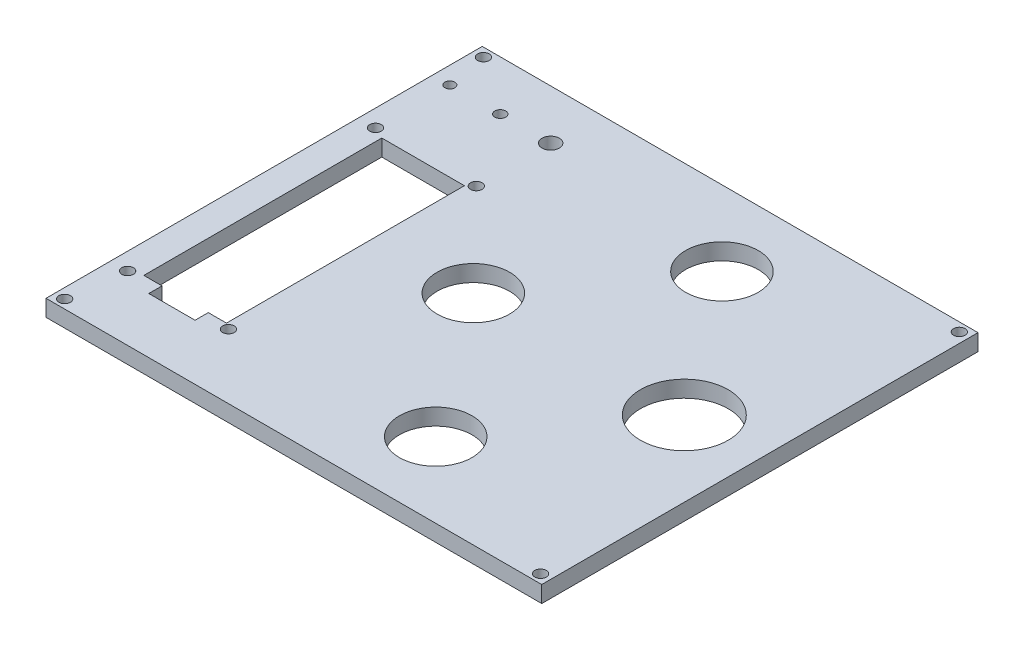
ISO-10303-21;
HEADER;
FILE_DESCRIPTION(('STEP AP214'),'2;1');
FILE_NAME('part.step','',(''),(''),'','','');
FILE_SCHEMA(('AUTOMOTIVE_DESIGN { 1 0 10303 214 1 1 1 1 }'));
ENDSEC;
DATA;
#1=APPLICATION_CONTEXT('core data for automotive mechanical design processes');
#2=APPLICATION_PROTOCOL_DEFINITION('international standard','automotive_design',2000,#1);
#3=PRODUCT_CONTEXT('',#1,'mechanical');
#4=PRODUCT('Part','Part','',(#3));
#5=PRODUCT_RELATED_PRODUCT_CATEGORY('part','',(#4));
#6=PRODUCT_DEFINITION_FORMATION('','',#4);
#7=PRODUCT_DEFINITION_CONTEXT('part definition',#1,'design');
#8=PRODUCT_DEFINITION('design','',#6,#7);
#9=PRODUCT_DEFINITION_SHAPE('','',#8);
#10=(LENGTH_UNIT() NAMED_UNIT(*) SI_UNIT(.MILLI.,.METRE.));
#11=(NAMED_UNIT(*) PLANE_ANGLE_UNIT() SI_UNIT($,.RADIAN.));
#12=(NAMED_UNIT(*) SI_UNIT($,.STERADIAN.) SOLID_ANGLE_UNIT());
#13=UNCERTAINTY_MEASURE_WITH_UNIT(LENGTH_MEASURE(1.E-05),#10,'distance_accuracy_value','');
#14=(GEOMETRIC_REPRESENTATION_CONTEXT(3) GLOBAL_UNCERTAINTY_ASSIGNED_CONTEXT((#13)) GLOBAL_UNIT_ASSIGNED_CONTEXT((#10,
#11,#12)) REPRESENTATION_CONTEXT('',''));
#15=CARTESIAN_POINT('',(0.,0.,0.));
#16=DIRECTION('',(0.,0.,1.));
#17=DIRECTION('',(1.,0.,0.));
#18=AXIS2_PLACEMENT_3D('',#15,#16,#17);
#19=CARTESIAN_POINT('',(0.,5.,0.));
#20=DIRECTION('',(0.,1.,0.));
#21=DIRECTION('',(0.,0.,1.));
#22=AXIS2_PLACEMENT_3D('',#19,#20,#21);
#23=PLANE('',#22);
#24=CARTESIAN_POINT('',(-11.7,5.,0.));
#25=DIRECTION('',(0.,1.,0.));
#26=DIRECTION('',(0.,0.,1.));
#27=AXIS2_PLACEMENT_3D('',#24,#25,#26);
#28=CIRCLE('',#27,10.975);
#29=CARTESIAN_POINT('',(-11.7,5.,10.975));
#30=VERTEX_POINT('',#29);
#31=EDGE_CURVE('E581',#30,#30,#28,.T.);
#32=ORIENTED_EDGE('',*,*,#31,.F.);
#33=EDGE_LOOP('',(#32));
#34=FACE_BOUND('',#33,.T.);
#35=CARTESIAN_POINT('',(20.2177973462517,5.,-43.3));
#36=DIRECTION('',(0.,1.,0.));
#37=DIRECTION('',(0.,0.,1.));
#38=AXIS2_PLACEMENT_3D('',#35,#36,#37);
#39=CIRCLE('',#38,10.975);
#40=CARTESIAN_POINT('',(20.2177973462517,5.,-32.325));
#41=VERTEX_POINT('',#40);
#42=EDGE_CURVE('E590',#41,#41,#39,.T.);
#43=ORIENTED_EDGE('',*,*,#42,.F.);
#44=EDGE_LOOP('',(#43));
#45=FACE_BOUND('',#44,.T.);
#46=CARTESIAN_POINT('',(20.2177973462517,5.,43.3));
#47=DIRECTION('',(0.,1.,0.));
#48=DIRECTION('',(0.,0.,1.));
#49=AXIS2_PLACEMENT_3D('',#46,#47,#48);
#50=CIRCLE('',#49,10.975);
#51=CARTESIAN_POINT('',(20.2177973462517,5.,54.275));
#52=VERTEX_POINT('',#51);
#53=EDGE_CURVE('E600',#52,#52,#50,.T.);
#54=ORIENTED_EDGE('',*,*,#53,.F.);
#55=EDGE_LOOP('',(#54));
#56=FACE_BOUND('',#55,.T.);
#57=CARTESIAN_POINT('',(52.1355946925034,5.,0.));
#58=DIRECTION('',(0.,1.,0.));
#59=DIRECTION('',(0.,0.,1.));
#60=AXIS2_PLACEMENT_3D('',#57,#58,#59);
#61=CIRCLE('',#60,13.275);
#62=CARTESIAN_POINT('',(52.1355946925034,5.,13.275));
#63=VERTEX_POINT('',#62);
#64=EDGE_CURVE('E608',#63,#63,#61,.T.);
#65=ORIENTED_EDGE('',*,*,#64,.F.);
#66=EDGE_LOOP('',(#65));
#67=FACE_BOUND('',#66,.T.);
#68=CARTESIAN_POINT('',(-69.8,5.,-51.));
#69=DIRECTION('',(0.,1.,0.));
#70=DIRECTION('',(0.,0.,1.));
#71=AXIS2_PLACEMENT_3D('',#68,#69,#70);
#72=CIRCLE('',#71,1.5);
#73=CARTESIAN_POINT('',(-69.8,5.,-49.5));
#74=VERTEX_POINT('',#73);
#75=EDGE_CURVE('E615',#74,#74,#72,.T.);
#76=ORIENTED_EDGE('',*,*,#75,.F.);
#77=EDGE_LOOP('',(#76));
#78=FACE_BOUND('',#77,.T.);
#79=CARTESIAN_POINT('',(-54.55,5.,-51.));
#80=DIRECTION('',(0.,1.,0.));
#81=DIRECTION('',(0.,0.,1.));
#82=AXIS2_PLACEMENT_3D('',#79,#80,#81);
#83=CIRCLE('',#82,1.64);
#84=CARTESIAN_POINT('',(-54.55,5.,-49.36));
#85=VERTEX_POINT('',#84);
#86=EDGE_CURVE('E623',#85,#85,#83,.T.);
#87=ORIENTED_EDGE('',*,*,#86,.F.);
#88=EDGE_LOOP('',(#87));
#89=FACE_BOUND('',#88,.T.);
#90=CARTESIAN_POINT('',(-39.3,5.,-51.));
#91=DIRECTION('',(0.,1.,0.));
#92=DIRECTION('',(0.,0.,1.));
#93=AXIS2_PLACEMENT_3D('',#90,#91,#92);
#94=CIRCLE('',#93,2.61);
#95=CARTESIAN_POINT('',(-39.3,5.,-48.39));
#96=VERTEX_POINT('',#95);
#97=EDGE_CURVE('E587',#96,#96,#94,.T.);
#98=ORIENTED_EDGE('',*,*,#97,.F.);
#99=EDGE_LOOP('',(#98));
#100=FACE_BOUND('',#99,.T.);
#101=CARTESIAN_POINT('',(-69.8,5.,-28.5));
#102=DIRECTION('',(0.,-1.,0.));
#103=DIRECTION('',(0.,0.,-1.));
#104=AXIS2_PLACEMENT_3D('',#101,#102,#103);
#105=CIRCLE('',#104,1.75);
#106=CARTESIAN_POINT('',(-69.8,5.,-30.25));
#107=VERTEX_POINT('',#106);
#108=EDGE_CURVE('E376',#107,#107,#105,.T.);
#109=ORIENTED_EDGE('',*,*,#108,.T.);
#110=EDGE_LOOP('',(#109));
#111=FACE_BOUND('',#110,.T.);
#112=CARTESIAN_POINT('',(-39.3,5.,46.5));
#113=DIRECTION('',(0.,-1.,0.));
#114=DIRECTION('',(0.,0.,-1.));
#115=AXIS2_PLACEMENT_3D('',#112,#113,#114);
#116=CIRCLE('',#115,1.75);
#117=CARTESIAN_POINT('',(-39.3,5.,44.75));
#118=VERTEX_POINT('',#117);
#119=EDGE_CURVE('E157',#118,#118,#116,.T.);
#120=ORIENTED_EDGE('',*,*,#119,.T.);
#121=EDGE_LOOP('',(#120));
#122=FACE_BOUND('',#121,.T.);
#123=DIRECTION('',(-1.,0.,0.));
#124=VECTOR('',#123,1.);
#125=CARTESIAN_POINT('',(0.,5.,49.2));
#126=LINE('',#125,#124);
#127=CARTESIAN_POINT('',(-46.7,5.,49.2));
#128=VERTEX_POINT('',#127);
#129=CARTESIAN_POINT('',(-60.7,5.,49.2));
#130=VERTEX_POINT('',#129);
#131=EDGE_CURVE('E137',#128,#130,#126,.T.);
#132=ORIENTED_EDGE('',*,*,#131,.T.);
#133=DIRECTION('',(0.,0.,1.));
#134=VECTOR('',#133,1.);
#135=CARTESIAN_POINT('',(-60.7,5.,0.));
#136=LINE('',#135,#134);
#137=CARTESIAN_POINT('',(-60.7,5.,45.2));
#138=VERTEX_POINT('',#137);
#139=EDGE_CURVE('E130',#138,#130,#136,.T.);
#140=ORIENTED_EDGE('',*,*,#139,.F.);
#141=DIRECTION('',(-1.,0.,0.));
#142=VECTOR('',#141,1.);
#143=CARTESIAN_POINT('',(1.7107527515815E-13,5.,45.1999999999998));
#144=LINE('',#143,#142);
#145=CARTESIAN_POINT('',(-66.2,5.,45.2));
#146=VERTEX_POINT('',#145);
#147=EDGE_CURVE('E140',#138,#146,#144,.T.);
#148=ORIENTED_EDGE('',*,*,#147,.T.);
#149=DIRECTION('',(0.,0.,-1.));
#150=VECTOR('',#149,1.);
#151=CARTESIAN_POINT('',(-66.2,5.,0.));
#152=LINE('',#151,#150);
#153=CARTESIAN_POINT('',(-66.2,5.,-26.8));
#154=VERTEX_POINT('',#153);
#155=EDGE_CURVE('E54',#146,#154,#152,.T.);
#156=ORIENTED_EDGE('',*,*,#155,.T.);
#157=DIRECTION('',(-1.,0.,0.));
#158=VECTOR('',#157,1.);
#159=CARTESIAN_POINT('',(0.,5.,-26.8));
#160=LINE('',#159,#158);
#161=CARTESIAN_POINT('',(-41.2,5.,-26.8));
#162=VERTEX_POINT('',#161);
#163=EDGE_CURVE('E162',#162,#154,#160,.T.);
#164=ORIENTED_EDGE('',*,*,#163,.F.);
#165=DIRECTION('',(0.,0.,-1.));
#166=VECTOR('',#165,1.);
#167=CARTESIAN_POINT('',(-41.2,5.,0.));
#168=LINE('',#167,#166);
#169=CARTESIAN_POINT('',(-41.2,5.,45.2));
#170=VERTEX_POINT('',#169);
#171=EDGE_CURVE('E165',#170,#162,#168,.T.);
#172=ORIENTED_EDGE('',*,*,#171,.F.);
#173=DIRECTION('',(-1.,0.,0.));
#174=VECTOR('',#173,1.);
#175=CARTESIAN_POINT('',(-1.71075275158149E-13,5.,45.2000000000002));
#176=LINE('',#175,#174);
#177=CARTESIAN_POINT('',(-46.7,5.,45.2));
#178=VERTEX_POINT('',#177);
#179=EDGE_CURVE('E168',#170,#178,#176,.T.);
#180=ORIENTED_EDGE('',*,*,#179,.T.);
#181=DIRECTION('',(0.,0.,1.));
#182=VECTOR('',#181,1.);
#183=CARTESIAN_POINT('',(-46.7,5.,0.));
#184=LINE('',#183,#182);
#185=EDGE_CURVE('E172',#178,#128,#184,.T.);
#186=ORIENTED_EDGE('',*,*,#185,.T.);
#187=EDGE_LOOP('',(#132,#140,#148,#156,#164,#172,#180,#186));
#188=FACE_BOUND('',#187,.T.);
#189=CARTESIAN_POINT('',(-71.997145932309,5.,63.3574884204319));
#190=DIRECTION('',(0.,1.,0.));
#191=DIRECTION('',(0.,0.,1.));
#192=AXIS2_PLACEMENT_3D('',#189,#190,#191);
#193=CIRCLE('',#192,1.75);
#194=CARTESIAN_POINT('',(-71.997145932309,5.,65.1074884204319));
#195=VERTEX_POINT('',#194);
#196=EDGE_CURVE('E223',#195,#195,#193,.T.);
#197=ORIENTED_EDGE('',*,*,#196,.F.);
#198=EDGE_LOOP('',(#197));
#199=FACE_BOUND('',#198,.T.);
#200=CARTESIAN_POINT('',(71.997145932309,5.,63.3574884204319));
#201=DIRECTION('',(0.,1.,0.));
#202=DIRECTION('',(0.,0.,-1.));
#203=AXIS2_PLACEMENT_3D('',#200,#201,#202);
#204=CIRCLE('',#203,1.74999999999998);
#205=CARTESIAN_POINT('',(71.997145932309,5.,61.6074884204319));
#206=VERTEX_POINT('',#205);
#207=EDGE_CURVE('E239',#206,#206,#204,.T.);
#208=ORIENTED_EDGE('',*,*,#207,.F.);
#209=EDGE_LOOP('',(#208));
#210=FACE_BOUND('',#209,.T.);
#211=DIRECTION('',(0.,0.,1.));
#212=VECTOR('',#211,1.);
#213=CARTESIAN_POINT('',(-75.,5.,-66.));
#214=LINE('',#213,#212);
#215=CARTESIAN_POINT('',(-75.,5.,-66.));
#216=VERTEX_POINT('',#215);
#217=CARTESIAN_POINT('',(-75.,5.,66.));
#218=VERTEX_POINT('',#217);
#219=EDGE_CURVE('E255',#216,#218,#214,.T.);
#220=ORIENTED_EDGE('',*,*,#219,.T.);
#221=DIRECTION('',(1.,0.,0.));
#222=VECTOR('',#221,1.);
#223=CARTESIAN_POINT('',(-75.,5.,66.));
#224=LINE('',#223,#222);
#225=CARTESIAN_POINT('',(75.,5.,66.));
#226=VERTEX_POINT('',#225);
#227=EDGE_CURVE('E259',#218,#226,#224,.T.);
#228=ORIENTED_EDGE('',*,*,#227,.T.);
#229=DIRECTION('',(0.,0.,-1.));
#230=VECTOR('',#229,1.);
#231=CARTESIAN_POINT('',(75.,5.,-66.));
#232=LINE('',#231,#230);
#233=CARTESIAN_POINT('',(75.,5.,-66.));
#234=VERTEX_POINT('',#233);
#235=EDGE_CURVE('E263',#226,#234,#232,.T.);
#236=ORIENTED_EDGE('',*,*,#235,.T.);
#237=DIRECTION('',(-1.,0.,0.));
#238=VECTOR('',#237,1.);
#239=CARTESIAN_POINT('',(-75.,5.,-66.));
#240=LINE('',#239,#238);
#241=EDGE_CURVE('E266',#234,#216,#240,.T.);
#242=ORIENTED_EDGE('',*,*,#241,.T.);
#243=EDGE_LOOP('',(#220,#228,#236,#242));
#244=FACE_BOUND('',#243,.T.);
#245=CARTESIAN_POINT('',(71.997145932309,5.,-63.3574884204319));
#246=DIRECTION('',(0.,1.,0.));
#247=DIRECTION('',(0.,0.,1.));
#248=AXIS2_PLACEMENT_3D('',#245,#246,#247);
#249=CIRCLE('',#248,1.74999999999998);
#250=CARTESIAN_POINT('',(71.997145932309,5.,-61.6074884204319));
#251=VERTEX_POINT('',#250);
#252=EDGE_CURVE('E247',#251,#251,#249,.T.);
#253=ORIENTED_EDGE('',*,*,#252,.F.);
#254=EDGE_LOOP('',(#253));
#255=FACE_BOUND('',#254,.T.);
#256=CARTESIAN_POINT('',(-71.997145932309,5.,-63.3574884204319));
#257=DIRECTION('',(0.,1.,0.));
#258=DIRECTION('',(0.,0.,-1.));
#259=AXIS2_PLACEMENT_3D('',#256,#257,#258);
#260=CIRCLE('',#259,1.75);
#261=CARTESIAN_POINT('',(-71.997145932309,5.,-65.1074884204319));
#262=VERTEX_POINT('',#261);
#263=EDGE_CURVE('E231',#262,#262,#260,.T.);
#264=ORIENTED_EDGE('',*,*,#263,.F.);
#265=EDGE_LOOP('',(#264));
#266=FACE_BOUND('',#265,.T.);
#267=CARTESIAN_POINT('',(-69.8,5.,46.5));
#268=DIRECTION('',(0.,-1.,0.));
#269=DIRECTION('',(0.,0.,-1.));
#270=AXIS2_PLACEMENT_3D('',#267,#268,#269);
#271=CIRCLE('',#270,1.75);
#272=CARTESIAN_POINT('',(-69.8,5.,44.75));
#273=VERTEX_POINT('',#272);
#274=EDGE_CURVE('E353',#273,#273,#271,.T.);
#275=ORIENTED_EDGE('',*,*,#274,.T.);
#276=EDGE_LOOP('',(#275));
#277=FACE_BOUND('',#276,.T.);
#278=CARTESIAN_POINT('',(-39.3,5.,-28.5));
#279=DIRECTION('',(0.,1.,0.));
#280=DIRECTION('',(0.,0.,1.));
#281=AXIS2_PLACEMENT_3D('',#278,#279,#280);
#282=CIRCLE('',#281,1.75);
#283=CARTESIAN_POINT('',(-39.3,5.,-26.75));
#284=VERTEX_POINT('',#283);
#285=EDGE_CURVE('E356',#284,#284,#282,.T.);
#286=ORIENTED_EDGE('',*,*,#285,.F.);
#287=EDGE_LOOP('',(#286));
#288=FACE_BOUND('',#287,.T.);
#289=ADVANCED_FACE('F38',(#34,#45,#56,#67,#78,#89,#100,#111,#122,#188,#199,#210,#244,#255,#266,
#277,#288),#23,.T.);
#290=CARTESIAN_POINT('',(0.,0.,0.));
#291=DIRECTION('',(0.,1.,0.));
#292=DIRECTION('',(0.,0.,1.));
#293=AXIS2_PLACEMENT_3D('',#290,#291,#292);
#294=PLANE('',#293);
#295=CARTESIAN_POINT('',(-11.7,0.,0.));
#296=DIRECTION('',(0.,1.,0.));
#297=DIRECTION('',(0.,0.,1.));
#298=AXIS2_PLACEMENT_3D('',#295,#296,#297);
#299=CIRCLE('',#298,10.975);
#300=CARTESIAN_POINT('',(-11.7,0.,10.975));
#301=VERTEX_POINT('',#300);
#302=EDGE_CURVE('E579',#301,#301,#299,.T.);
#303=ORIENTED_EDGE('',*,*,#302,.T.);
#304=EDGE_LOOP('',(#303));
#305=FACE_BOUND('',#304,.T.);
#306=CARTESIAN_POINT('',(20.2177973462517,0.,-43.3));
#307=DIRECTION('',(0.,1.,0.));
#308=DIRECTION('',(0.,0.,1.));
#309=AXIS2_PLACEMENT_3D('',#306,#307,#308);
#310=CIRCLE('',#309,10.975);
#311=CARTESIAN_POINT('',(20.2177973462517,0.,-32.325));
#312=VERTEX_POINT('',#311);
#313=EDGE_CURVE('E583',#312,#312,#310,.T.);
#314=ORIENTED_EDGE('',*,*,#313,.T.);
#315=EDGE_LOOP('',(#314));
#316=FACE_BOUND('',#315,.T.);
#317=CARTESIAN_POINT('',(20.2177973462517,0.,43.3));
#318=DIRECTION('',(0.,1.,0.));
#319=DIRECTION('',(0.,0.,1.));
#320=AXIS2_PLACEMENT_3D('',#317,#318,#319);
#321=CIRCLE('',#320,10.975);
#322=CARTESIAN_POINT('',(20.2177973462517,0.,54.275));
#323=VERTEX_POINT('',#322);
#324=EDGE_CURVE('E596',#323,#323,#321,.T.);
#325=ORIENTED_EDGE('',*,*,#324,.T.);
#326=EDGE_LOOP('',(#325));
#327=FACE_BOUND('',#326,.T.);
#328=CARTESIAN_POINT('',(52.1355946925034,0.,0.));
#329=DIRECTION('',(0.,1.,0.));
#330=DIRECTION('',(0.,0.,1.));
#331=AXIS2_PLACEMENT_3D('',#328,#329,#330);
#332=CIRCLE('',#331,13.275);
#333=CARTESIAN_POINT('',(52.1355946925034,0.,13.275));
#334=VERTEX_POINT('',#333);
#335=EDGE_CURVE('E604',#334,#334,#332,.T.);
#336=ORIENTED_EDGE('',*,*,#335,.T.);
#337=EDGE_LOOP('',(#336));
#338=FACE_BOUND('',#337,.T.);
#339=CARTESIAN_POINT('',(-69.8,0.,-51.));
#340=DIRECTION('',(0.,1.,0.));
#341=DIRECTION('',(0.,0.,1.));
#342=AXIS2_PLACEMENT_3D('',#339,#340,#341);
#343=CIRCLE('',#342,1.5);
#344=CARTESIAN_POINT('',(-69.8,0.,-49.5));
#345=VERTEX_POINT('',#344);
#346=EDGE_CURVE('E372',#345,#345,#343,.T.);
#347=ORIENTED_EDGE('',*,*,#346,.T.);
#348=EDGE_LOOP('',(#347));
#349=FACE_BOUND('',#348,.T.);
#350=CARTESIAN_POINT('',(-54.55,0.,-51.));
#351=DIRECTION('',(0.,1.,0.));
#352=DIRECTION('',(0.,0.,1.));
#353=AXIS2_PLACEMENT_3D('',#350,#351,#352);
#354=CIRCLE('',#353,1.64);
#355=CARTESIAN_POINT('',(-54.55,0.,-49.36));
#356=VERTEX_POINT('',#355);
#357=EDGE_CURVE('E619',#356,#356,#354,.T.);
#358=ORIENTED_EDGE('',*,*,#357,.T.);
#359=EDGE_LOOP('',(#358));
#360=FACE_BOUND('',#359,.T.);
#361=CARTESIAN_POINT('',(-39.3,0.,-51.));
#362=DIRECTION('',(0.,1.,0.));
#363=DIRECTION('',(0.,0.,1.));
#364=AXIS2_PLACEMENT_3D('',#361,#362,#363);
#365=CIRCLE('',#364,2.61);
#366=CARTESIAN_POINT('',(-39.3,0.,-48.39));
#367=VERTEX_POINT('',#366);
#368=EDGE_CURVE('E627',#367,#367,#365,.T.);
#369=ORIENTED_EDGE('',*,*,#368,.T.);
#370=EDGE_LOOP('',(#369));
#371=FACE_BOUND('',#370,.T.);
#372=CARTESIAN_POINT('',(-69.8,0.,-28.5));
#373=DIRECTION('',(0.,-1.,0.));
#374=DIRECTION('',(0.,0.,-1.));
#375=AXIS2_PLACEMENT_3D('',#372,#373,#374);
#376=CIRCLE('',#375,1.75);
#377=CARTESIAN_POINT('',(-69.8,0.,-30.25));
#378=VERTEX_POINT('',#377);
#379=EDGE_CURVE('E180',#378,#378,#376,.T.);
#380=ORIENTED_EDGE('',*,*,#379,.F.);
#381=EDGE_LOOP('',(#380));
#382=FACE_BOUND('',#381,.T.);
#383=CARTESIAN_POINT('',(-39.3,0.,46.5));
#384=DIRECTION('',(0.,-1.,0.));
#385=DIRECTION('',(0.,0.,-1.));
#386=AXIS2_PLACEMENT_3D('',#383,#384,#385);
#387=CIRCLE('',#386,1.75);
#388=CARTESIAN_POINT('',(-39.3,0.,44.75));
#389=VERTEX_POINT('',#388);
#390=EDGE_CURVE('E379',#389,#389,#387,.T.);
#391=ORIENTED_EDGE('',*,*,#390,.F.);
#392=EDGE_LOOP('',(#391));
#393=FACE_BOUND('',#392,.T.);
#394=CARTESIAN_POINT('',(-69.8,0.,46.5));
#395=DIRECTION('',(0.,-1.,0.));
#396=DIRECTION('',(0.,0.,-1.));
#397=AXIS2_PLACEMENT_3D('',#394,#395,#396);
#398=CIRCLE('',#397,1.75);
#399=CARTESIAN_POINT('',(-69.8,0.,44.75));
#400=VERTEX_POINT('',#399);
#401=EDGE_CURVE('E360',#400,#400,#398,.T.);
#402=ORIENTED_EDGE('',*,*,#401,.F.);
#403=EDGE_LOOP('',(#402));
#404=FACE_BOUND('',#403,.T.);
#405=CARTESIAN_POINT('',(-71.997145932309,0.,63.3574884204319));
#406=DIRECTION('',(0.,1.,0.));
#407=DIRECTION('',(0.,0.,1.));
#408=AXIS2_PLACEMENT_3D('',#405,#406,#407);
#409=CIRCLE('',#408,1.75);
#410=CARTESIAN_POINT('',(-71.997145932309,0.,65.1074884204319));
#411=VERTEX_POINT('',#410);
#412=EDGE_CURVE('E205',#411,#411,#409,.T.);
#413=ORIENTED_EDGE('',*,*,#412,.T.);
#414=EDGE_LOOP('',(#413));
#415=FACE_BOUND('',#414,.T.);
#416=CARTESIAN_POINT('',(-71.997145932309,0.,-63.3574884204319));
#417=DIRECTION('',(0.,1.,0.));
#418=DIRECTION('',(0.,0.,-1.));
#419=AXIS2_PLACEMENT_3D('',#416,#417,#418);
#420=CIRCLE('',#419,1.75);
#421=CARTESIAN_POINT('',(-71.997145932309,0.,-65.1074884204319));
#422=VERTEX_POINT('',#421);
#423=EDGE_CURVE('E227',#422,#422,#420,.T.);
#424=ORIENTED_EDGE('',*,*,#423,.T.);
#425=EDGE_LOOP('',(#424));
#426=FACE_BOUND('',#425,.T.);
#427=CARTESIAN_POINT('',(71.997145932309,0.,63.3574884204319));
#428=DIRECTION('',(0.,1.,0.));
#429=DIRECTION('',(0.,0.,-1.));
#430=AXIS2_PLACEMENT_3D('',#427,#428,#429);
#431=CIRCLE('',#430,1.74999999999998);
#432=CARTESIAN_POINT('',(71.997145932309,0.,61.6074884204319));
#433=VERTEX_POINT('',#432);
#434=EDGE_CURVE('E235',#433,#433,#431,.T.);
#435=ORIENTED_EDGE('',*,*,#434,.T.);
#436=EDGE_LOOP('',(#435));
#437=FACE_BOUND('',#436,.T.);
#438=CARTESIAN_POINT('',(71.997145932309,0.,-63.3574884204319));
#439=DIRECTION('',(0.,1.,0.));
#440=DIRECTION('',(0.,0.,1.));
#441=AXIS2_PLACEMENT_3D('',#438,#439,#440);
#442=CIRCLE('',#441,1.74999999999998);
#443=CARTESIAN_POINT('',(71.997145932309,0.,-61.6074884204319));
#444=VERTEX_POINT('',#443);
#445=EDGE_CURVE('E243',#444,#444,#442,.T.);
#446=ORIENTED_EDGE('',*,*,#445,.T.);
#447=EDGE_LOOP('',(#446));
#448=FACE_BOUND('',#447,.T.);
#449=DIRECTION('',(0.,0.,1.));
#450=VECTOR('',#449,1.);
#451=CARTESIAN_POINT('',(-75.,0.,-66.));
#452=LINE('',#451,#450);
#453=CARTESIAN_POINT('',(-75.,0.,-66.));
#454=VERTEX_POINT('',#453);
#455=CARTESIAN_POINT('',(-75.,0.,66.));
#456=VERTEX_POINT('',#455);
#457=EDGE_CURVE('E251',#454,#456,#452,.T.);
#458=ORIENTED_EDGE('',*,*,#457,.F.);
#459=DIRECTION('',(-1.,0.,0.));
#460=VECTOR('',#459,1.);
#461=CARTESIAN_POINT('',(-75.,0.,-66.));
#462=LINE('',#461,#460);
#463=CARTESIAN_POINT('',(75.,0.,-66.));
#464=VERTEX_POINT('',#463);
#465=EDGE_CURVE('E260',#464,#454,#462,.T.);
#466=ORIENTED_EDGE('',*,*,#465,.F.);
#467=DIRECTION('',(0.,0.,-1.));
#468=VECTOR('',#467,1.);
#469=CARTESIAN_POINT('',(75.,0.,-66.));
#470=LINE('',#469,#468);
#471=CARTESIAN_POINT('',(75.,0.,66.));
#472=VERTEX_POINT('',#471);
#473=EDGE_CURVE('E276',#472,#464,#470,.T.);
#474=ORIENTED_EDGE('',*,*,#473,.F.);
#475=DIRECTION('',(1.,0.,0.));
#476=VECTOR('',#475,1.);
#477=CARTESIAN_POINT('',(-75.,0.,66.));
#478=LINE('',#477,#476);
#479=EDGE_CURVE('E273',#456,#472,#478,.T.);
#480=ORIENTED_EDGE('',*,*,#479,.F.);
#481=EDGE_LOOP('',(#458,#466,#474,#480));
#482=FACE_BOUND('',#481,.T.);
#483=DIRECTION('',(0.,0.,1.));
#484=VECTOR('',#483,1.);
#485=CARTESIAN_POINT('',(-60.7,0.,0.));
#486=LINE('',#485,#484);
#487=CARTESIAN_POINT('',(-60.7,0.,45.2));
#488=VERTEX_POINT('',#487);
#489=CARTESIAN_POINT('',(-60.7,0.,49.2));
#490=VERTEX_POINT('',#489);
#491=EDGE_CURVE('E62',#488,#490,#486,.T.);
#492=ORIENTED_EDGE('',*,*,#491,.T.);
#493=DIRECTION('',(-1.,0.,0.));
#494=VECTOR('',#493,1.);
#495=CARTESIAN_POINT('',(0.,0.,49.2));
#496=LINE('',#495,#494);
#497=CARTESIAN_POINT('',(-46.7,0.,49.2));
#498=VERTEX_POINT('',#497);
#499=EDGE_CURVE('E150',#498,#490,#496,.T.);
#500=ORIENTED_EDGE('',*,*,#499,.F.);
#501=DIRECTION('',(0.,0.,1.));
#502=VECTOR('',#501,1.);
#503=CARTESIAN_POINT('',(-46.7,0.,0.));
#504=LINE('',#503,#502);
#505=CARTESIAN_POINT('',(-46.7,0.,45.2));
#506=VERTEX_POINT('',#505);
#507=EDGE_CURVE('E154',#506,#498,#504,.T.);
#508=ORIENTED_EDGE('',*,*,#507,.F.);
#509=DIRECTION('',(-1.,0.,0.));
#510=VECTOR('',#509,1.);
#511=CARTESIAN_POINT('',(-1.71075275158149E-13,0.,45.2000000000002));
#512=LINE('',#511,#510);
#513=CARTESIAN_POINT('',(-41.2,0.,45.2));
#514=VERTEX_POINT('',#513);
#515=EDGE_CURVE('E195',#514,#506,#512,.T.);
#516=ORIENTED_EDGE('',*,*,#515,.F.);
#517=DIRECTION('',(0.,0.,-1.));
#518=VECTOR('',#517,1.);
#519=CARTESIAN_POINT('',(-41.2,0.,0.));
#520=LINE('',#519,#518);
#521=CARTESIAN_POINT('',(-41.2,0.,-26.8));
#522=VERTEX_POINT('',#521);
#523=EDGE_CURVE('E191',#514,#522,#520,.T.);
#524=ORIENTED_EDGE('',*,*,#523,.T.);
#525=DIRECTION('',(-1.,0.,0.));
#526=VECTOR('',#525,1.);
#527=CARTESIAN_POINT('',(0.,0.,-26.8));
#528=LINE('',#527,#526);
#529=CARTESIAN_POINT('',(-66.2,0.,-26.8));
#530=VERTEX_POINT('',#529);
#531=EDGE_CURVE('E187',#522,#530,#528,.T.);
#532=ORIENTED_EDGE('',*,*,#531,.T.);
#533=DIRECTION('',(0.,0.,-1.));
#534=VECTOR('',#533,1.);
#535=CARTESIAN_POINT('',(-66.2,0.,0.));
#536=LINE('',#535,#534);
#537=CARTESIAN_POINT('',(-66.2,0.,45.2));
#538=VERTEX_POINT('',#537);
#539=EDGE_CURVE('E183',#538,#530,#536,.T.);
#540=ORIENTED_EDGE('',*,*,#539,.F.);
#541=DIRECTION('',(-1.,0.,0.));
#542=VECTOR('',#541,1.);
#543=CARTESIAN_POINT('',(1.7107527515815E-13,0.,45.1999999999998));
#544=LINE('',#543,#542);
#545=EDGE_CURVE('E179',#488,#538,#544,.T.);
#546=ORIENTED_EDGE('',*,*,#545,.F.);
#547=EDGE_LOOP('',(#492,#500,#508,#516,#524,#532,#540,#546));
#548=FACE_BOUND('',#547,.T.);
#549=CARTESIAN_POINT('',(-39.3,0.,-28.5));
#550=DIRECTION('',(0.,1.,0.));
#551=DIRECTION('',(0.,0.,1.));
#552=AXIS2_PLACEMENT_3D('',#549,#550,#551);
#553=CIRCLE('',#552,1.75);
#554=CARTESIAN_POINT('',(-39.3,0.,-26.75));
#555=VERTEX_POINT('',#554);
#556=EDGE_CURVE('E359',#555,#555,#553,.T.);
#557=ORIENTED_EDGE('',*,*,#556,.T.);
#558=EDGE_LOOP('',(#557));
#559=FACE_BOUND('',#558,.T.);
#560=ADVANCED_FACE('F299',(#305,#316,#327,#338,#349,#360,#371,#382,#393,#404,#415,#426,#437,
#448,#482,#548,#559),#294,.F.);
#561=CARTESIAN_POINT('',(-75.,5.,-66.));
#562=DIRECTION('',(1.,0.,0.));
#563=DIRECTION('',(0.,0.,-1.));
#564=AXIS2_PLACEMENT_3D('',#561,#562,#563);
#565=PLANE('',#564);
#566=ORIENTED_EDGE('',*,*,#457,.T.);
#567=DIRECTION('',(0.,-1.,0.));
#568=VECTOR('',#567,1.);
#569=CARTESIAN_POINT('',(-75.,5.,66.));
#570=LINE('',#569,#568);
#571=EDGE_CURVE('E11',#218,#456,#570,.T.);
#572=ORIENTED_EDGE('',*,*,#571,.F.);
#573=ORIENTED_EDGE('',*,*,#219,.F.);
#574=DIRECTION('',(0.,-1.,0.));
#575=VECTOR('',#574,1.);
#576=CARTESIAN_POINT('',(-75.,5.,-66.));
#577=LINE('',#576,#575);
#578=EDGE_CURVE('E269',#216,#454,#577,.T.);
#579=ORIENTED_EDGE('',*,*,#578,.T.);
#580=EDGE_LOOP('',(#566,#572,#573,#579));
#581=FACE_BOUND('',#580,.T.);
#582=ADVANCED_FACE('F40',(#581),#565,.F.);
#583=CARTESIAN_POINT('',(-75.,5.,66.));
#584=DIRECTION('',(0.,0.,-1.));
#585=DIRECTION('',(-1.,0.,0.));
#586=AXIS2_PLACEMENT_3D('',#583,#584,#585);
#587=PLANE('',#586);
#588=ORIENTED_EDGE('',*,*,#479,.T.);
#589=DIRECTION('',(0.,-1.,0.));
#590=VECTOR('',#589,1.);
#591=CARTESIAN_POINT('',(75.,5.,66.));
#592=LINE('',#591,#590);
#593=EDGE_CURVE('E47',#226,#472,#592,.T.);
#594=ORIENTED_EDGE('',*,*,#593,.F.);
#595=ORIENTED_EDGE('',*,*,#227,.F.);
#596=ORIENTED_EDGE('',*,*,#571,.T.);
#597=EDGE_LOOP('',(#588,#594,#595,#596));
#598=FACE_BOUND('',#597,.T.);
#599=ADVANCED_FACE('F310',(#598),#587,.F.);
#600=CARTESIAN_POINT('',(75.,5.,-66.));
#601=DIRECTION('',(-1.,0.,0.));
#602=DIRECTION('',(0.,0.,1.));
#603=AXIS2_PLACEMENT_3D('',#600,#601,#602);
#604=PLANE('',#603);
#605=ORIENTED_EDGE('',*,*,#473,.T.);
#606=DIRECTION('',(0.,-1.,0.));
#607=VECTOR('',#606,1.);
#608=CARTESIAN_POINT('',(75.,5.,-66.));
#609=LINE('',#608,#607);
#610=EDGE_CURVE('E284',#234,#464,#609,.T.);
#611=ORIENTED_EDGE('',*,*,#610,.F.);
#612=ORIENTED_EDGE('',*,*,#235,.F.);
#613=ORIENTED_EDGE('',*,*,#593,.T.);
#614=EDGE_LOOP('',(#605,#611,#612,#613));
#615=FACE_BOUND('',#614,.T.);
#616=ADVANCED_FACE('F293',(#615),#604,.F.);
#617=CARTESIAN_POINT('',(-75.,5.,-66.));
#618=DIRECTION('',(0.,0.,1.));
#619=DIRECTION('',(1.,0.,0.));
#620=AXIS2_PLACEMENT_3D('',#617,#618,#619);
#621=PLANE('',#620);
#622=ORIENTED_EDGE('',*,*,#465,.T.);
#623=ORIENTED_EDGE('',*,*,#578,.F.);
#624=ORIENTED_EDGE('',*,*,#241,.F.);
#625=ORIENTED_EDGE('',*,*,#610,.T.);
#626=EDGE_LOOP('',(#622,#623,#624,#625));
#627=FACE_BOUND('',#626,.T.);
#628=ADVANCED_FACE('F303',(#627),#621,.F.);
#629=CARTESIAN_POINT('',(71.997145932309,5.,-63.3574884204319));
#630=DIRECTION('',(0.,-1.,0.));
#631=DIRECTION('',(0.,0.,-1.));
#632=AXIS2_PLACEMENT_3D('',#629,#630,#631);
#633=CYLINDRICAL_SURFACE('',#632,1.74999999999998);
#634=ORIENTED_EDGE('',*,*,#252,.T.);
#635=EDGE_LOOP('',(#634));
#636=FACE_BOUND('',#635,.T.);
#637=ORIENTED_EDGE('',*,*,#445,.F.);
#638=EDGE_LOOP('',(#637));
#639=FACE_BOUND('',#638,.T.);
#640=ADVANCED_FACE('F329',(#636,#639),#633,.F.);
#641=CARTESIAN_POINT('',(71.997145932309,5.,63.3574884204319));
#642=DIRECTION('',(0.,-1.,0.));
#643=DIRECTION('',(0.,0.,-1.));
#644=AXIS2_PLACEMENT_3D('',#641,#642,#643);
#645=CYLINDRICAL_SURFACE('',#644,1.74999999999998);
#646=ORIENTED_EDGE('',*,*,#207,.T.);
#647=EDGE_LOOP('',(#646));
#648=FACE_BOUND('',#647,.T.);
#649=ORIENTED_EDGE('',*,*,#434,.F.);
#650=EDGE_LOOP('',(#649));
#651=FACE_BOUND('',#650,.T.);
#652=ADVANCED_FACE('F336',(#648,#651),#645,.F.);
#653=CARTESIAN_POINT('',(-71.997145932309,5.,-63.3574884204319));
#654=DIRECTION('',(0.,-1.,0.));
#655=DIRECTION('',(0.,0.,-1.));
#656=AXIS2_PLACEMENT_3D('',#653,#654,#655);
#657=CYLINDRICAL_SURFACE('',#656,1.75);
#658=ORIENTED_EDGE('',*,*,#263,.T.);
#659=EDGE_LOOP('',(#658));
#660=FACE_BOUND('',#659,.T.);
#661=ORIENTED_EDGE('',*,*,#423,.F.);
#662=EDGE_LOOP('',(#661));
#663=FACE_BOUND('',#662,.T.);
#664=ADVANCED_FACE('F341',(#660,#663),#657,.F.);
#665=CARTESIAN_POINT('',(-71.997145932309,5.,63.3574884204319));
#666=DIRECTION('',(0.,-1.,0.));
#667=DIRECTION('',(0.,0.,-1.));
#668=AXIS2_PLACEMENT_3D('',#665,#666,#667);
#669=CYLINDRICAL_SURFACE('',#668,1.75);
#670=ORIENTED_EDGE('',*,*,#196,.T.);
#671=EDGE_LOOP('',(#670));
#672=FACE_BOUND('',#671,.T.);
#673=ORIENTED_EDGE('',*,*,#412,.F.);
#674=EDGE_LOOP('',(#673));
#675=FACE_BOUND('',#674,.T.);
#676=ADVANCED_FACE('F432',(#672,#675),#669,.F.);
#677=CARTESIAN_POINT('',(-60.7,5.,0.));
#678=DIRECTION('',(1.,0.,0.));
#679=DIRECTION('',(0.,0.,-1.));
#680=AXIS2_PLACEMENT_3D('',#677,#678,#679);
#681=PLANE('',#680);
#682=ORIENTED_EDGE('',*,*,#491,.F.);
#683=DIRECTION('',(0.,-1.,0.));
#684=VECTOR('',#683,1.);
#685=CARTESIAN_POINT('',(-60.7,5.,45.2));
#686=LINE('',#685,#684);
#687=EDGE_CURVE('E126',#138,#488,#686,.T.);
#688=ORIENTED_EDGE('',*,*,#687,.F.);
#689=ORIENTED_EDGE('',*,*,#139,.T.);
#690=DIRECTION('',(0.,-1.,0.));
#691=VECTOR('',#690,1.);
#692=CARTESIAN_POINT('',(-60.7,5.,49.2));
#693=LINE('',#692,#691);
#694=EDGE_CURVE('E202',#130,#490,#693,.T.);
#695=ORIENTED_EDGE('',*,*,#694,.T.);
#696=EDGE_LOOP('',(#682,#688,#689,#695));
#697=FACE_BOUND('',#696,.T.);
#698=ADVANCED_FACE('F128',(#697),#681,.T.);
#699=CARTESIAN_POINT('',(0.,5.,49.2));
#700=DIRECTION('',(0.,0.,1.));
#701=DIRECTION('',(1.,0.,0.));
#702=AXIS2_PLACEMENT_3D('',#699,#700,#701);
#703=PLANE('',#702);
#704=ORIENTED_EDGE('',*,*,#499,.T.);
#705=ORIENTED_EDGE('',*,*,#694,.F.);
#706=ORIENTED_EDGE('',*,*,#131,.F.);
#707=DIRECTION('',(0.,-1.,0.));
#708=VECTOR('',#707,1.);
#709=CARTESIAN_POINT('',(-46.7,5.,49.2));
#710=LINE('',#709,#708);
#711=EDGE_CURVE('E206',#128,#498,#710,.T.);
#712=ORIENTED_EDGE('',*,*,#711,.T.);
#713=EDGE_LOOP('',(#704,#705,#706,#712));
#714=FACE_BOUND('',#713,.T.);
#715=ADVANCED_FACE('F405',(#714),#703,.F.);
#716=CARTESIAN_POINT('',(-46.7,5.,0.));
#717=DIRECTION('',(1.,0.,0.));
#718=DIRECTION('',(0.,0.,-1.));
#719=AXIS2_PLACEMENT_3D('',#716,#717,#718);
#720=PLANE('',#719);
#721=ORIENTED_EDGE('',*,*,#507,.T.);
#722=ORIENTED_EDGE('',*,*,#711,.F.);
#723=ORIENTED_EDGE('',*,*,#185,.F.);
#724=DIRECTION('',(0.,-1.,0.));
#725=VECTOR('',#724,1.);
#726=CARTESIAN_POINT('',(-46.7,5.,45.2));
#727=LINE('',#726,#725);
#728=EDGE_CURVE('E209',#178,#506,#727,.T.);
#729=ORIENTED_EDGE('',*,*,#728,.T.);
#730=EDGE_LOOP('',(#721,#722,#723,#729));
#731=FACE_BOUND('',#730,.T.);
#732=ADVANCED_FACE('F408',(#731),#720,.F.);
#733=CARTESIAN_POINT('',(-1.71075275158149E-13,5.,45.2000000000002));
#734=DIRECTION('',(0.,0.,1.));
#735=DIRECTION('',(1.,0.,0.));
#736=AXIS2_PLACEMENT_3D('',#733,#734,#735);
#737=PLANE('',#736);
#738=ORIENTED_EDGE('',*,*,#515,.T.);
#739=ORIENTED_EDGE('',*,*,#728,.F.);
#740=ORIENTED_EDGE('',*,*,#179,.F.);
#741=DIRECTION('',(0.,-1.,0.));
#742=VECTOR('',#741,1.);
#743=CARTESIAN_POINT('',(-41.2,5.,45.2));
#744=LINE('',#743,#742);
#745=EDGE_CURVE('E212',#170,#514,#744,.T.);
#746=ORIENTED_EDGE('',*,*,#745,.T.);
#747=EDGE_LOOP('',(#738,#739,#740,#746));
#748=FACE_BOUND('',#747,.T.);
#749=ADVANCED_FACE('F412',(#748),#737,.F.);
#750=CARTESIAN_POINT('',(-41.2,5.,0.));
#751=DIRECTION('',(-1.,0.,0.));
#752=DIRECTION('',(0.,0.,1.));
#753=AXIS2_PLACEMENT_3D('',#750,#751,#752);
#754=PLANE('',#753);
#755=ORIENTED_EDGE('',*,*,#523,.F.);
#756=ORIENTED_EDGE('',*,*,#745,.F.);
#757=ORIENTED_EDGE('',*,*,#171,.T.);
#758=DIRECTION('',(0.,-1.,0.));
#759=VECTOR('',#758,1.);
#760=CARTESIAN_POINT('',(-41.2,5.,-26.8));
#761=LINE('',#760,#759);
#762=EDGE_CURVE('E215',#162,#522,#761,.T.);
#763=ORIENTED_EDGE('',*,*,#762,.T.);
#764=EDGE_LOOP('',(#755,#756,#757,#763));
#765=FACE_BOUND('',#764,.T.);
#766=ADVANCED_FACE('F416',(#765),#754,.T.);
#767=CARTESIAN_POINT('',(0.,5.,-26.8));
#768=DIRECTION('',(0.,0.,1.));
#769=DIRECTION('',(1.,0.,0.));
#770=AXIS2_PLACEMENT_3D('',#767,#768,#769);
#771=PLANE('',#770);
#772=ORIENTED_EDGE('',*,*,#531,.F.);
#773=ORIENTED_EDGE('',*,*,#762,.F.);
#774=ORIENTED_EDGE('',*,*,#163,.T.);
#775=DIRECTION('',(0.,-1.,0.));
#776=VECTOR('',#775,1.);
#777=CARTESIAN_POINT('',(-66.2,5.,-26.8));
#778=LINE('',#777,#776);
#779=EDGE_CURVE('E218',#154,#530,#778,.T.);
#780=ORIENTED_EDGE('',*,*,#779,.T.);
#781=EDGE_LOOP('',(#772,#773,#774,#780));
#782=FACE_BOUND('',#781,.T.);
#783=ADVANCED_FACE('F420',(#782),#771,.T.);
#784=CARTESIAN_POINT('',(-66.2,5.,0.));
#785=DIRECTION('',(-1.,0.,0.));
#786=DIRECTION('',(0.,0.,1.));
#787=AXIS2_PLACEMENT_3D('',#784,#785,#786);
#788=PLANE('',#787);
#789=ORIENTED_EDGE('',*,*,#539,.T.);
#790=ORIENTED_EDGE('',*,*,#779,.F.);
#791=ORIENTED_EDGE('',*,*,#155,.F.);
#792=DIRECTION('',(0.,-1.,0.));
#793=VECTOR('',#792,1.);
#794=CARTESIAN_POINT('',(-66.2,5.,45.2));
#795=LINE('',#794,#793);
#796=EDGE_CURVE('E136',#146,#538,#795,.T.);
#797=ORIENTED_EDGE('',*,*,#796,.T.);
#798=EDGE_LOOP('',(#789,#790,#791,#797));
#799=FACE_BOUND('',#798,.T.);
#800=ADVANCED_FACE('F424',(#799),#788,.F.);
#801=CARTESIAN_POINT('',(1.7107527515815E-13,5.,45.1999999999998));
#802=DIRECTION('',(0.,0.,1.));
#803=DIRECTION('',(1.,0.,0.));
#804=AXIS2_PLACEMENT_3D('',#801,#802,#803);
#805=PLANE('',#804);
#806=ORIENTED_EDGE('',*,*,#545,.T.);
#807=ORIENTED_EDGE('',*,*,#796,.F.);
#808=ORIENTED_EDGE('',*,*,#147,.F.);
#809=ORIENTED_EDGE('',*,*,#687,.T.);
#810=EDGE_LOOP('',(#806,#807,#808,#809));
#811=FACE_BOUND('',#810,.T.);
#812=ADVANCED_FACE('F141',(#811),#805,.F.);
#813=CARTESIAN_POINT('',(-69.8,5.,46.5));
#814=DIRECTION('',(0.,-1.,0.));
#815=DIRECTION('',(0.,0.,-1.));
#816=AXIS2_PLACEMENT_3D('',#813,#814,#815);
#817=CYLINDRICAL_SURFACE('',#816,1.75);
#818=ORIENTED_EDGE('',*,*,#274,.F.);
#819=EDGE_LOOP('',(#818));
#820=FACE_BOUND('',#819,.T.);
#821=ORIENTED_EDGE('',*,*,#401,.T.);
#822=EDGE_LOOP('',(#821));
#823=FACE_BOUND('',#822,.T.);
#824=ADVANCED_FACE('F401',(#820,#823),#817,.F.);
#825=CARTESIAN_POINT('',(-39.3,5.,-28.5));
#826=DIRECTION('',(0.,-1.,0.));
#827=DIRECTION('',(0.,0.,-1.));
#828=AXIS2_PLACEMENT_3D('',#825,#826,#827);
#829=CYLINDRICAL_SURFACE('',#828,1.75);
#830=ORIENTED_EDGE('',*,*,#285,.T.);
#831=EDGE_LOOP('',(#830));
#832=FACE_BOUND('',#831,.T.);
#833=ORIENTED_EDGE('',*,*,#556,.F.);
#834=EDGE_LOOP('',(#833));
#835=FACE_BOUND('',#834,.T.);
#836=ADVANCED_FACE('F392',(#832,#835),#829,.F.);
#837=CARTESIAN_POINT('',(-39.3,5.,46.5));
#838=DIRECTION('',(0.,-1.,0.));
#839=DIRECTION('',(0.,0.,-1.));
#840=AXIS2_PLACEMENT_3D('',#837,#838,#839);
#841=CYLINDRICAL_SURFACE('',#840,1.75);
#842=ORIENTED_EDGE('',*,*,#119,.F.);
#843=EDGE_LOOP('',(#842));
#844=FACE_BOUND('',#843,.T.);
#845=ORIENTED_EDGE('',*,*,#390,.T.);
#846=EDGE_LOOP('',(#845));
#847=FACE_BOUND('',#846,.T.);
#848=ADVANCED_FACE('F389',(#844,#847),#841,.F.);
#849=CARTESIAN_POINT('',(-69.8,5.,-28.5));
#850=DIRECTION('',(0.,-1.,0.));
#851=DIRECTION('',(0.,0.,-1.));
#852=AXIS2_PLACEMENT_3D('',#849,#850,#851);
#853=CYLINDRICAL_SURFACE('',#852,1.75);
#854=ORIENTED_EDGE('',*,*,#108,.F.);
#855=EDGE_LOOP('',(#854));
#856=FACE_BOUND('',#855,.T.);
#857=ORIENTED_EDGE('',*,*,#379,.T.);
#858=EDGE_LOOP('',(#857));
#859=FACE_BOUND('',#858,.T.);
#860=ADVANCED_FACE('F391',(#856,#859),#853,.F.);
#861=CARTESIAN_POINT('',(-39.3,0.,-51.));
#862=DIRECTION('',(0.,1.,0.));
#863=DIRECTION('',(0.,0.,1.));
#864=AXIS2_PLACEMENT_3D('',#861,#862,#863);
#865=CYLINDRICAL_SURFACE('',#864,2.61);
#866=ORIENTED_EDGE('',*,*,#368,.F.);
#867=EDGE_LOOP('',(#866));
#868=FACE_BOUND('',#867,.T.);
#869=ORIENTED_EDGE('',*,*,#97,.T.);
#870=EDGE_LOOP('',(#869));
#871=FACE_BOUND('',#870,.T.);
#872=ADVANCED_FACE('F398',(#868,#871),#865,.F.);
#873=CARTESIAN_POINT('',(-54.55,0.,-51.));
#874=DIRECTION('',(0.,1.,0.));
#875=DIRECTION('',(0.,0.,1.));
#876=AXIS2_PLACEMENT_3D('',#873,#874,#875);
#877=CYLINDRICAL_SURFACE('',#876,1.64);
#878=ORIENTED_EDGE('',*,*,#357,.F.);
#879=EDGE_LOOP('',(#878));
#880=FACE_BOUND('',#879,.T.);
#881=ORIENTED_EDGE('',*,*,#86,.T.);
#882=EDGE_LOOP('',(#881));
#883=FACE_BOUND('',#882,.T.);
#884=ADVANCED_FACE('F513',(#880,#883),#877,.F.);
#885=CARTESIAN_POINT('',(-69.8,0.,-51.));
#886=DIRECTION('',(0.,1.,0.));
#887=DIRECTION('',(0.,0.,1.));
#888=AXIS2_PLACEMENT_3D('',#885,#886,#887);
#889=CYLINDRICAL_SURFACE('',#888,1.5);
#890=ORIENTED_EDGE('',*,*,#346,.F.);
#891=EDGE_LOOP('',(#890));
#892=FACE_BOUND('',#891,.T.);
#893=ORIENTED_EDGE('',*,*,#75,.T.);
#894=EDGE_LOOP('',(#893));
#895=FACE_BOUND('',#894,.T.);
#896=ADVANCED_FACE('F522',(#892,#895),#889,.F.);
#897=CARTESIAN_POINT('',(52.1355946925034,0.,0.));
#898=DIRECTION('',(0.,1.,0.));
#899=DIRECTION('',(0.,0.,1.));
#900=AXIS2_PLACEMENT_3D('',#897,#898,#899);
#901=CYLINDRICAL_SURFACE('',#900,13.275);
#902=ORIENTED_EDGE('',*,*,#335,.F.);
#903=EDGE_LOOP('',(#902));
#904=FACE_BOUND('',#903,.T.);
#905=ORIENTED_EDGE('',*,*,#64,.T.);
#906=EDGE_LOOP('',(#905));
#907=FACE_BOUND('',#906,.T.);
#908=ADVANCED_FACE('F531',(#904,#907),#901,.F.);
#909=CARTESIAN_POINT('',(20.2177973462517,0.,43.3));
#910=DIRECTION('',(0.,1.,0.));
#911=DIRECTION('',(0.,0.,1.));
#912=AXIS2_PLACEMENT_3D('',#909,#910,#911);
#913=CYLINDRICAL_SURFACE('',#912,10.975);
#914=ORIENTED_EDGE('',*,*,#324,.F.);
#915=EDGE_LOOP('',(#914));
#916=FACE_BOUND('',#915,.T.);
#917=ORIENTED_EDGE('',*,*,#53,.T.);
#918=EDGE_LOOP('',(#917));
#919=FACE_BOUND('',#918,.T.);
#920=ADVANCED_FACE('F542',(#916,#919),#913,.F.);
#921=CARTESIAN_POINT('',(20.2177973462517,0.,-43.3));
#922=DIRECTION('',(0.,1.,0.));
#923=DIRECTION('',(0.,0.,1.));
#924=AXIS2_PLACEMENT_3D('',#921,#922,#923);
#925=CYLINDRICAL_SURFACE('',#924,10.975);
#926=ORIENTED_EDGE('',*,*,#313,.F.);
#927=EDGE_LOOP('',(#926));
#928=FACE_BOUND('',#927,.T.);
#929=ORIENTED_EDGE('',*,*,#42,.T.);
#930=EDGE_LOOP('',(#929));
#931=FACE_BOUND('',#930,.T.);
#932=ADVANCED_FACE('F549',(#928,#931),#925,.F.);
#933=CARTESIAN_POINT('',(-11.7,0.,0.));
#934=DIRECTION('',(0.,1.,0.));
#935=DIRECTION('',(0.,0.,1.));
#936=AXIS2_PLACEMENT_3D('',#933,#934,#935);
#937=CYLINDRICAL_SURFACE('',#936,10.975);
#938=ORIENTED_EDGE('',*,*,#302,.F.);
#939=EDGE_LOOP('',(#938));
#940=FACE_BOUND('',#939,.T.);
#941=ORIENTED_EDGE('',*,*,#31,.T.);
#942=EDGE_LOOP('',(#941));
#943=FACE_BOUND('',#942,.T.);
#944=ADVANCED_FACE('F557',(#940,#943),#937,.F.);
#945=CLOSED_SHELL('',(#289,#560,#582,#599,#616,#628,#640,#652,#664,#676,#698,#715,#732,#749,
#766,#783,#800,#812,#824,#836,#848,#860,#872,#884,#896,#908,#920,#932,#944));
#946=MANIFOLD_SOLID_BREP('B2',#945);
#947=ADVANCED_BREP_SHAPE_REPRESENTATION('',(#18,#946),#14);
#948=SHAPE_DEFINITION_REPRESENTATION(#9,#947);
ENDSEC;
END-ISO-10303-21;
